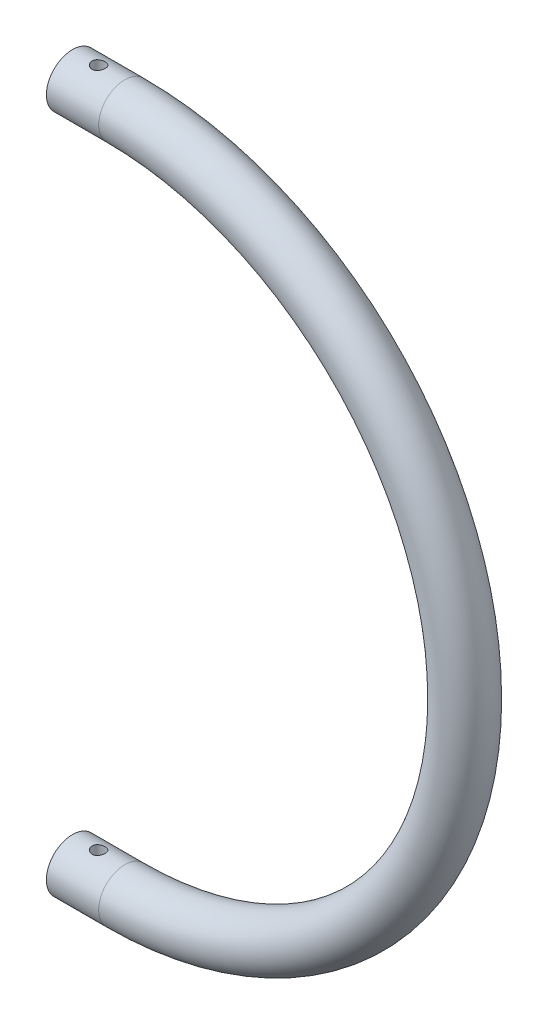
ISO-10303-21;
HEADER;
FILE_DESCRIPTION(('STEP AP214'),'2;1');
FILE_NAME('part.step','',(''),(''),'','','');
FILE_SCHEMA(('AUTOMOTIVE_DESIGN { 1 0 10303 214 1 1 1 1 }'));
ENDSEC;
DATA;
#1=APPLICATION_CONTEXT('core data for automotive mechanical design processes');
#2=APPLICATION_PROTOCOL_DEFINITION('international standard','automotive_design',2000,#1);
#3=PRODUCT_CONTEXT('',#1,'mechanical');
#4=PRODUCT('Part','Part','',(#3));
#5=PRODUCT_RELATED_PRODUCT_CATEGORY('part','',(#4));
#6=PRODUCT_DEFINITION_FORMATION('','',#4);
#7=PRODUCT_DEFINITION_CONTEXT('part definition',#1,'design');
#8=PRODUCT_DEFINITION('design','',#6,#7);
#9=PRODUCT_DEFINITION_SHAPE('','',#8);
#10=(LENGTH_UNIT() NAMED_UNIT(*) SI_UNIT(.MILLI.,.METRE.));
#11=(NAMED_UNIT(*) PLANE_ANGLE_UNIT() SI_UNIT($,.RADIAN.));
#12=(NAMED_UNIT(*) SI_UNIT($,.STERADIAN.) SOLID_ANGLE_UNIT());
#13=UNCERTAINTY_MEASURE_WITH_UNIT(LENGTH_MEASURE(1.E-05),#10,'distance_accuracy_value','');
#14=(GEOMETRIC_REPRESENTATION_CONTEXT(3) GLOBAL_UNCERTAINTY_ASSIGNED_CONTEXT((#13)) GLOBAL_UNIT_ASSIGNED_CONTEXT((#10,
#11,#12)) REPRESENTATION_CONTEXT('',''));
#15=CARTESIAN_POINT('',(0.,0.,0.));
#16=DIRECTION('',(0.,0.,1.));
#17=DIRECTION('',(1.,0.,0.));
#18=AXIS2_PLACEMENT_3D('',#15,#16,#17);
#19=CARTESIAN_POINT('',(0.,0.,0.));
#20=DIRECTION('',(0.,0.,1.));
#21=DIRECTION('',(1.,0.,0.));
#22=AXIS2_PLACEMENT_3D('',#19,#20,#21);
#23=TOROIDAL_SURFACE('',#22,130.,10.);
#24=CARTESIAN_POINT('',(0.,-130.,0.));
#25=DIRECTION('',(1.,0.,0.));
#26=DIRECTION('',(0.,1.,0.));
#27=AXIS2_PLACEMENT_3D('',#24,#25,#26);
#28=CIRCLE('',#27,10.);
#29=CARTESIAN_POINT('',(0.,-140.,0.));
#30=VERTEX_POINT('',#29);
#31=EDGE_CURVE('E52',#30,#30,#28,.T.);
#32=CARTESIAN_POINT('',(0.,130.,0.));
#33=DIRECTION('',(-1.,0.,0.));
#34=DIRECTION('',(0.,-1.,0.));
#35=AXIS2_PLACEMENT_3D('',#32,#33,#34);
#36=CIRCLE('',#35,10.);
#37=CARTESIAN_POINT('',(0.,140.,0.));
#38=VERTEX_POINT('',#37);
#39=EDGE_CURVE('E48',#38,#38,#36,.T.);
#40=CARTESIAN_POINT('',(0.,0.,0.));
#41=DIRECTION('',(0.,0.,1.));
#42=DIRECTION('',(1.,0.,0.));
#43=AXIS2_PLACEMENT_3D('',#40,#41,#42);
#44=CIRCLE('',#43,140.);
#45=EDGE_CURVE('',#30,#38,#44,.T.);
#46=ORIENTED_EDGE('',*,*,#31,.T.);
#47=ORIENTED_EDGE('',*,*,#39,.F.);
#48=ORIENTED_EDGE('',*,*,#45,.T.);
#49=ORIENTED_EDGE('',*,*,#45,.F.);
#50=EDGE_LOOP('',(#46,#48,#47,#49));
#51=FACE_BOUND('',#50,.T.);
#52=ADVANCED_FACE('F37',(#51),#23,.T.);
#53=CARTESIAN_POINT('',(-20.,-130.,0.));
#54=DIRECTION('',(1.,0.,0.));
#55=DIRECTION('',(0.,1.,0.));
#56=AXIS2_PLACEMENT_3D('',#53,#54,#55);
#57=CYLINDRICAL_SURFACE('',#56,10.);
#58=CARTESIAN_POINT('',(-12.5,-120.,0.));
#59=CARTESIAN_POINT('',(-12.4999961237697,-120.000002335533,-0.138126814449552));
#60=CARTESIAN_POINT('',(-12.4885140820437,-120.00289036447,-0.276296929717939));
#61=CARTESIAN_POINT('',(-12.442958081155,-120.014131436168,-0.548677206284221));
#62=CARTESIAN_POINT('',(-12.4088713174369,-120.022487576334,-0.682885078117899));
#63=CARTESIAN_POINT('',(-12.3192679108965,-120.043739561133,-0.943368120304294));
#64=CARTESIAN_POINT('',(-12.2637770021412,-120.056629952632,-1.06965260571667));
#65=CARTESIAN_POINT('',(-12.1330310165919,-120.085577603206,-1.31112021984071));
#66=CARTESIAN_POINT('',(-12.0577752731351,-120.101634969097,-1.4263029739146));
#67=CARTESIAN_POINT('',(-11.8879986839097,-120.135543106805,-1.64466987883486));
#68=CARTESIAN_POINT('',(-11.7931473750682,-120.153421547531,-1.74759281676843));
#69=CARTESIAN_POINT('',(-11.5875796584849,-120.188772998034,-1.93624821200553));
#70=CARTESIAN_POINT('',(-11.4768614617551,-120.206245961836,-2.02197872824865));
#71=CARTESIAN_POINT('',(-11.240674622105,-120.239087071697,-2.17504423799829));
#72=CARTESIAN_POINT('',(-11.1150112819855,-120.254420092253,-2.2420870265419));
#73=CARTESIAN_POINT('',(-10.8537526472333,-120.280841753033,-2.35399484758457));
#74=CARTESIAN_POINT('',(-10.7181589444466,-120.29193107176,-2.39886342573357));
#75=CARTESIAN_POINT('',(-10.4437608363306,-120.308325388395,-2.46425806134127));
#76=CARTESIAN_POINT('',(-10.30507517327,-120.313741816716,-2.48525378055342));
#77=CARTESIAN_POINT('',(-10.0260523850011,-120.318510625673,-2.50376962511068));
#78=CARTESIAN_POINT('',(-9.88571553217977,-120.317863992868,-2.50129356969685));
#79=CARTESIAN_POINT('',(-9.61097365375774,-120.310679908053,-2.47331087439951));
#80=CARTESIAN_POINT('',(-9.47650729755778,-120.304285616545,-2.44836390031772));
#81=CARTESIAN_POINT('',(-9.2137315818149,-120.286554838816,-2.37704031150499));
#82=CARTESIAN_POINT('',(-9.08542266161846,-120.275218000513,-2.33066217011565));
#83=CARTESIAN_POINT('',(-8.83710330624645,-120.248748101572,-2.21731579656197));
#84=CARTESIAN_POINT('',(-8.71718971368405,-120.233577875503,-2.1501444453882));
#85=CARTESIAN_POINT('',(-8.49013548373863,-120.2011714859,-1.99726046002491));
#86=CARTESIAN_POINT('',(-8.38299708655458,-120.18393496109,-1.91154458134806));
#87=CARTESIAN_POINT('',(-8.18132730717599,-120.148735324335,-1.72110570780203));
#88=CARTESIAN_POINT('',(-8.08724251656441,-120.1307655087,-1.61591043027643));
#89=CARTESIAN_POINT('',(-7.91796459589349,-120.096567240354,-1.39101986250616));
#90=CARTESIAN_POINT('',(-7.84277204289406,-120.080338840843,-1.27132412951324));
#91=CARTESIAN_POINT('',(-7.71324902295936,-120.051371131763,-1.02019314780232));
#92=CARTESIAN_POINT('',(-7.65899109957595,-120.038643997871,-0.888718988681036));
#93=CARTESIAN_POINT('',(-7.57347115715071,-120.018201383476,-0.618126680238134));
#94=CARTESIAN_POINT('',(-7.5422047393031,-120.010484944345,-0.479009998584138));
#95=CARTESIAN_POINT('',(-7.50423739073527,-120.001075012144,-0.200899950650043));
#96=CARTESIAN_POINT('',(-7.4969282898745,-119.999232441529,-0.0619945333136815));
#97=CARTESIAN_POINT('',(-7.50541500342581,-120.001353253092,0.215054791335849));
#98=CARTESIAN_POINT('',(-7.52120873799856,-120.005316112636,0.353198766074328));
#99=CARTESIAN_POINT('',(-7.57495151398563,-120.018506981211,0.622690447960818));
#100=CARTESIAN_POINT('',(-7.61256877246162,-120.027656096904,0.754108531614584));
#101=CARTESIAN_POINT('',(-7.7085118067141,-120.050188222764,1.00876215408753));
#102=CARTESIAN_POINT('',(-7.76683967385537,-120.0635716605,1.13199686505442));
#103=CARTESIAN_POINT('',(-7.90372688145779,-120.093444867896,1.36920522404972));
#104=CARTESIAN_POINT('',(-7.98262685399427,-120.10998554389,1.48297573639294));
#105=CARTESIAN_POINT('',(-8.15798318132861,-120.144258180204,1.69587768940552));
#106=CARTESIAN_POINT('',(-8.25444256602941,-120.161990345784,1.79500659828875));
#107=CARTESIAN_POINT('',(-8.46500326807284,-120.197184050675,1.97831761345414));
#108=CARTESIAN_POINT('',(-8.57947950499927,-120.214628263625,2.06207311270184));
#109=CARTESIAN_POINT('',(-8.82122105744763,-120.246785360299,2.20918459835605));
#110=CARTESIAN_POINT('',(-8.94848580495074,-120.261498365251,2.27254149026901));
#111=CARTESIAN_POINT('',(-9.21150953734373,-120.286365088053,2.37658570101224));
#112=CARTESIAN_POINT('',(-9.34721271385383,-120.296545746242,2.41740732773931));
#113=CARTESIAN_POINT('',(-9.62384939642549,-120.311220932934,2.47557609990489));
#114=CARTESIAN_POINT('',(-9.76478175170242,-120.31571670496,2.49292837912652));
#115=CARTESIAN_POINT('',(-10.0435350397693,-120.318418312984,2.50339765056083));
#116=CARTESIAN_POINT('',(-10.1813290585441,-120.31680112112,2.49719649630132));
#117=CARTESIAN_POINT('',(-10.4538398144438,-120.307868183279,2.46229546385366));
#118=CARTESIAN_POINT('',(-10.5885566133553,-120.300552551823,2.43359603781099));
#119=CARTESIAN_POINT('',(-10.8503474317764,-120.281145655268,2.35488553240496));
#120=CARTESIAN_POINT('',(-10.9774621754005,-120.269083079389,2.30500234113404));
#121=CARTESIAN_POINT('',(-11.2216089711893,-120.241537404592,2.18544152267504));
#122=CARTESIAN_POINT('',(-11.3386396219781,-120.226053831322,2.11576115005696));
#123=CARTESIAN_POINT('',(-11.5625910483368,-120.192906095607,1.95644624772858));
#124=CARTESIAN_POINT('',(-11.6691684557066,-120.175195586137,1.86633860485376));
#125=CARTESIAN_POINT('',(-11.8659117413257,-120.139866212562,1.66964895198289));
#126=CARTESIAN_POINT('',(-11.9560737168549,-120.122247371216,1.56306303543524));
#127=CARTESIAN_POINT('',(-12.1190188476077,-120.088705739205,1.33411264450432));
#128=CARTESIAN_POINT('',(-12.1914576894526,-120.072819443902,1.21149737052731));
#129=CARTESIAN_POINT('',(-12.3145791049009,-120.044917917081,0.95544343251746));
#130=CARTESIAN_POINT('',(-12.3652772677476,-120.032899913337,0.8220126057279));
#131=CARTESIAN_POINT('',(-12.4359530505494,-120.015865673908,0.57401708873912));
#132=CARTESIAN_POINT('',(-12.4599187384224,-120.009956915788,0.460633618180115));
#133=CARTESIAN_POINT('',(-12.4919432393699,-120.002023246134,0.231510119227139));
#134=CARTESIAN_POINT('',(-12.5000032488422,-119.999998042485,0.115770268737694));
#135=CARTESIAN_POINT('',(-12.5,-120.,0.));
#136=B_SPLINE_CURVE_WITH_KNOTS('',3,(#58,#59,#60,#61,#62,#63,#64,#65,#66,#67,#68,#69,#70,#71,
#72,#73,#74,#75,#76,#77,#78,#79,#80,#81,#82,#83,#84,#85,#86,#87,#88,#89,#90,#91,#92,#93,#94,#95,
#96,#97,#98,#99,#100,#101,#102,#103,#104,#105,#106,#107,#108,#109,#110,#111,#112,#113,#114,#115,
#116,#117,#118,#119,#120,#121,#122,#123,#124,#125,#126,#127,#128,#129,#130,#131,#132,#133,#134,
#135),.UNSPECIFIED.,.T.,.F.,(4,2,2,2,2,2,2,2,2,2,2,2,2,2,2,2,2,2,2,2,2,2,2,2,2,2,2,2,2,2,2,2,2,
2,2,2,2,2,4),(0.,0.413956187453149,0.828147062939833,1.24184150381018,1.65554990028221,
2.07690725728565,2.4983121596677,2.92597745909678,3.35357435282281,3.77260491835116,
4.19156730193363,4.60037495017231,5.00921172448932,5.42217546462,5.83521151399139,
6.26002501620567,6.6848514926928,7.11113715020725,7.53734122819939,7.95263848254328,
8.36789835193439,8.7770045752893,9.18615212209352,9.60255979281121,10.0190393835223,
10.4457418201299,10.8724253125471,11.2965375769764,11.7205570543048,12.1323963400748,
12.5442273493652,12.9536066760888,13.3630428023797,13.7831596069298,14.2033761629383,
14.6312030917578,15.0587227304538,15.4057040491338,15.752659267482),.UNSPECIFIED.);
#137=CARTESIAN_POINT('',(-12.5,-120.,0.));
#138=VERTEX_POINT('',#137);
#139=EDGE_CURVE('E76',#138,#138,#136,.T.);
#140=ORIENTED_EDGE('',*,*,#139,.T.);
#141=EDGE_LOOP('',(#140));
#142=FACE_BOUND('',#141,.T.);
#143=CARTESIAN_POINT('',(-7.5,-140.,0.));
#144=CARTESIAN_POINT('',(-7.50000387623026,-139.999997664467,-0.138126814449552));
#145=CARTESIAN_POINT('',(-7.51148591795631,-139.99710963553,-0.276296929717938));
#146=CARTESIAN_POINT('',(-7.55704191884501,-139.985868563832,-0.548677206284221));
#147=CARTESIAN_POINT('',(-7.59112868256308,-139.977512423666,-0.682885078117899));
#148=CARTESIAN_POINT('',(-7.68073208910348,-139.956260438867,-0.943368120304295));
#149=CARTESIAN_POINT('',(-7.73622299785878,-139.943370047368,-1.06965260571667));
#150=CARTESIAN_POINT('',(-7.86696898340807,-139.914422396794,-1.31112021984071));
#151=CARTESIAN_POINT('',(-7.94222472686495,-139.898365030903,-1.42630297391461));
#152=CARTESIAN_POINT('',(-8.1120013160903,-139.864456893195,-1.64466987883486));
#153=CARTESIAN_POINT('',(-8.20685262493177,-139.846578452469,-1.74759281676843));
#154=CARTESIAN_POINT('',(-8.41242034151506,-139.811227001966,-1.93624821200553));
#155=CARTESIAN_POINT('',(-8.52313853824489,-139.793754038164,-2.02197872824865));
#156=CARTESIAN_POINT('',(-8.75932537789499,-139.760912928303,-2.17504423799829));
#157=CARTESIAN_POINT('',(-8.88498871801455,-139.745579907747,-2.2420870265419));
#158=CARTESIAN_POINT('',(-9.14624735276672,-139.719158246967,-2.35399484758457));
#159=CARTESIAN_POINT('',(-9.28184105555336,-139.70806892824,-2.39886342573357));
#160=CARTESIAN_POINT('',(-9.55623916366943,-139.691674611605,-2.46425806134127));
#161=CARTESIAN_POINT('',(-9.69492482672999,-139.686258183284,-2.48525378055342));
#162=CARTESIAN_POINT('',(-9.97394761499891,-139.681489374327,-2.50376962511068));
#163=CARTESIAN_POINT('',(-10.1142844678202,-139.682136007132,-2.50129356969685));
#164=CARTESIAN_POINT('',(-10.3890263462423,-139.689320091947,-2.47331087439951));
#165=CARTESIAN_POINT('',(-10.5234927024422,-139.695714383455,-2.44836390031772));
#166=CARTESIAN_POINT('',(-10.7862684181851,-139.713445161184,-2.37704031150499));
#167=CARTESIAN_POINT('',(-10.9145773383815,-139.724781999487,-2.33066217011565));
#168=CARTESIAN_POINT('',(-11.1628966937535,-139.751251898428,-2.21731579656197));
#169=CARTESIAN_POINT('',(-11.2828102863159,-139.766422124497,-2.1501444453882));
#170=CARTESIAN_POINT('',(-11.5098645162614,-139.7988285141,-1.99726046002491));
#171=CARTESIAN_POINT('',(-11.6170029134454,-139.81606503891,-1.91154458134806));
#172=CARTESIAN_POINT('',(-11.818672692824,-139.851264675665,-1.72110570780203));
#173=CARTESIAN_POINT('',(-11.9127574834356,-139.8692344913,-1.61591043027643));
#174=CARTESIAN_POINT('',(-12.0820354041065,-139.903432759646,-1.39101986250616));
#175=CARTESIAN_POINT('',(-12.1572279571059,-139.919661159157,-1.27132412951324));
#176=CARTESIAN_POINT('',(-12.2867509770406,-139.948628868236,-1.02019314780232));
#177=CARTESIAN_POINT('',(-12.341008900424,-139.961356002129,-0.888718988681035));
#178=CARTESIAN_POINT('',(-12.4265288428493,-139.981798616524,-0.618126680238133));
#179=CARTESIAN_POINT('',(-12.4577952606969,-139.989515055655,-0.479009998584136));
#180=CARTESIAN_POINT('',(-12.4957626092647,-139.998924987856,-0.20089995065004));
#181=CARTESIAN_POINT('',(-12.5030717101255,-140.000767558471,-0.0619945333136788));
#182=CARTESIAN_POINT('',(-12.4945849965742,-139.998646746908,0.215054791335851));
#183=CARTESIAN_POINT('',(-12.4787912620014,-139.994683887364,0.353198766074331));
#184=CARTESIAN_POINT('',(-12.4250484860144,-139.981493018789,0.622690447960821));
#185=CARTESIAN_POINT('',(-12.3874312275384,-139.972343903096,0.754108531614587));
#186=CARTESIAN_POINT('',(-12.2914881932859,-139.949811777236,1.00876215408753));
#187=CARTESIAN_POINT('',(-12.2331603261446,-139.9364283395,1.13199686505442));
#188=CARTESIAN_POINT('',(-12.0962731185422,-139.906555132104,1.36920522404972));
#189=CARTESIAN_POINT('',(-12.0173731460057,-139.89001445611,1.48297573639295));
#190=CARTESIAN_POINT('',(-11.8420168186714,-139.855741819796,1.69587768940552));
#191=CARTESIAN_POINT('',(-11.7455574339706,-139.838009654216,1.79500659828875));
#192=CARTESIAN_POINT('',(-11.5349967319272,-139.802815949325,1.97831761345414));
#193=CARTESIAN_POINT('',(-11.4205204950007,-139.785371736375,2.06207311270184));
#194=CARTESIAN_POINT('',(-11.1787789425524,-139.753214639701,2.20918459835605));
#195=CARTESIAN_POINT('',(-11.0515141950493,-139.738501634749,2.27254149026901));
#196=CARTESIAN_POINT('',(-10.7884904626563,-139.713634911947,2.37658570101224));
#197=CARTESIAN_POINT('',(-10.6527872861462,-139.703454253758,2.41740732773931));
#198=CARTESIAN_POINT('',(-10.3761506035745,-139.688779067066,2.47557609990489));
#199=CARTESIAN_POINT('',(-10.2352182482976,-139.68428329504,2.49292837912652));
#200=CARTESIAN_POINT('',(-9.95646496023065,-139.681581687016,2.50339765056083));
#201=CARTESIAN_POINT('',(-9.81867094145593,-139.68319887888,2.49719649630132));
#202=CARTESIAN_POINT('',(-9.54616018555623,-139.692131816721,2.46229546385366));
#203=CARTESIAN_POINT('',(-9.41144338664468,-139.699447448177,2.43359603781098));
#204=CARTESIAN_POINT('',(-9.14965256822356,-139.718854344732,2.35488553240495));
#205=CARTESIAN_POINT('',(-9.02253782459945,-139.730916920611,2.30500234113404));
#206=CARTESIAN_POINT('',(-8.77839102881072,-139.758462595408,2.18544152267504));
#207=CARTESIAN_POINT('',(-8.66136037802186,-139.773946168678,2.11576115005696));
#208=CARTESIAN_POINT('',(-8.43740895166324,-139.807093904393,1.95644624772858));
#209=CARTESIAN_POINT('',(-8.33083154429339,-139.824804413863,1.86633860485376));
#210=CARTESIAN_POINT('',(-8.13408825867434,-139.860133787438,1.66964895198288));
#211=CARTESIAN_POINT('',(-8.04392628314506,-139.877752628784,1.56306303543524));
#212=CARTESIAN_POINT('',(-7.88098115239232,-139.911294260794,1.33411264450432));
#213=CARTESIAN_POINT('',(-7.80854231054737,-139.927180556098,1.21149737052731));
#214=CARTESIAN_POINT('',(-7.68542089509912,-139.955082082919,0.95544343251746));
#215=CARTESIAN_POINT('',(-7.63472273225244,-139.967100086663,0.8220126057279));
#216=CARTESIAN_POINT('',(-7.56404694945058,-139.984134326092,0.574017088739121));
#217=CARTESIAN_POINT('',(-7.54008126157761,-139.990043084211,0.460633618180115));
#218=CARTESIAN_POINT('',(-7.5080567606301,-139.997976753866,0.231510119227139));
#219=CARTESIAN_POINT('',(-7.49999675115783,-140.000001957515,0.115770268737694));
#220=CARTESIAN_POINT('',(-7.5,-140.,0.));
#221=B_SPLINE_CURVE_WITH_KNOTS('',3,(#143,#144,#145,#146,#147,#148,#149,#150,#151,#152,#153,
#154,#155,#156,#157,#158,#159,#160,#161,#162,#163,#164,#165,#166,#167,#168,#169,#170,#171,#172,
#173,#174,#175,#176,#177,#178,#179,#180,#181,#182,#183,#184,#185,#186,#187,#188,#189,#190,#191,
#192,#193,#194,#195,#196,#197,#198,#199,#200,#201,#202,#203,#204,#205,#206,#207,#208,#209,#210,
#211,#212,#213,#214,#215,#216,#217,#218,#219,#220),.UNSPECIFIED.,.T.,.F.,(4,2,2,2,2,2,2,2,2,2,2,
2,2,2,2,2,2,2,2,2,2,2,2,2,2,2,2,2,2,2,2,2,2,2,2,2,2,2,4),(0.,0.41395618745315,0.828147062939832,
1.24184150381018,1.65554990028221,2.07690725728565,2.49831215966769,2.92597745909678,
3.3535743528228,3.77260491835116,4.19156730193363,4.60037495017231,5.00921172448932,
5.42217546461999,5.83521151399139,6.26002501620566,6.6848514926928,7.11113715020725,
7.5373412281994,7.95263848254328,8.36789835193439,8.7770045752893,9.18615212209352,
9.60255979281122,10.0190393835223,10.4457418201299,10.8724253125472,11.2965375769764,
11.7205570543048,12.1323963400748,12.5442273493652,12.9536066760888,13.3630428023797,
13.7831596069298,14.2033761629383,14.6312030917578,15.0587227304538,15.4057040491338,
15.752659267482),.UNSPECIFIED.);
#222=CARTESIAN_POINT('',(-7.5,-140.,0.));
#223=VERTEX_POINT('',#222);
#224=EDGE_CURVE('E72',#223,#223,#221,.T.);
#225=ORIENTED_EDGE('',*,*,#224,.T.);
#226=EDGE_LOOP('',(#225));
#227=FACE_BOUND('',#226,.T.);
#228=CARTESIAN_POINT('',(-20.,-130.,0.));
#229=DIRECTION('',(-1.,0.,0.));
#230=DIRECTION('',(0.,-1.,0.));
#231=AXIS2_PLACEMENT_3D('',#228,#229,#230);
#232=CIRCLE('',#231,10.);
#233=CARTESIAN_POINT('',(-20.,-140.,0.));
#234=VERTEX_POINT('',#233);
#235=EDGE_CURVE('E102',#234,#234,#232,.T.);
#236=ORIENTED_EDGE('',*,*,#235,.F.);
#237=EDGE_LOOP('',(#236));
#238=FACE_BOUND('',#237,.T.);
#239=ORIENTED_EDGE('',*,*,#31,.F.);
#240=EDGE_LOOP('',(#239));
#241=FACE_BOUND('',#240,.T.);
#242=ADVANCED_FACE('F80',(#142,#227,#238,#241),#57,.T.);
#243=CARTESIAN_POINT('',(-20.,-130.,0.));
#244=DIRECTION('',(-1.,0.,0.));
#245=DIRECTION('',(0.,-1.,0.));
#246=AXIS2_PLACEMENT_3D('',#243,#244,#245);
#247=PLANE('',#246);
#248=ORIENTED_EDGE('',*,*,#235,.T.);
#249=EDGE_LOOP('',(#248));
#250=FACE_BOUND('',#249,.T.);
#251=ADVANCED_FACE('F83',(#250),#247,.T.);
#252=CARTESIAN_POINT('',(-20.,130.,0.));
#253=DIRECTION('',(1.,0.,0.));
#254=DIRECTION('',(0.,1.,0.));
#255=AXIS2_PLACEMENT_3D('',#252,#253,#254);
#256=CYLINDRICAL_SURFACE('',#255,10.);
#257=CARTESIAN_POINT('',(-10.,120.317541634481,2.5));
#258=CARTESIAN_POINT('',(-9.86194924907342,120.317538999121,2.49999607859307));
#259=CARTESIAN_POINT('',(-9.72385510132148,120.314556939854,2.48852624549765));
#260=CARTESIAN_POINT('',(-9.45163242182649,120.302981380074,2.44302312546379));
#261=CARTESIAN_POINT('',(-9.31750624553182,120.294384613784,2.40897670674211));
#262=CARTESIAN_POINT('',(-9.05719646181282,120.272612754038,2.31949119963204));
#263=CARTESIAN_POINT('',(-8.93100284461429,120.259443573095,2.26407972785449));
#264=CARTESIAN_POINT('',(-8.68968914746012,120.230018079712,2.13352114126138));
#265=CARTESIAN_POINT('',(-8.57456953791978,120.213761636215,2.05837318856069));
#266=CARTESIAN_POINT('',(-8.35613835473778,120.179592836444,1.88870842731188));
#267=CARTESIAN_POINT('',(-8.25310639964995,120.16165402377,1.79383688770405));
#268=CARTESIAN_POINT('',(-8.06423860563966,120.126371244847,1.58818206410066));
#269=CARTESIAN_POINT('',(-7.97840437437825,120.109027334336,1.47739729418031));
#270=CARTESIAN_POINT('',(-7.82522453236872,120.076595844794,1.24114520107895));
#271=CARTESIAN_POINT('',(-7.75815361183853,120.061543125994,1.11549457619512));
#272=CARTESIAN_POINT('',(-7.64619035584692,120.03569188074,0.854263184292762));
#273=CARTESIAN_POINT('',(-7.60129474808449,120.024892726657,0.71868388579194));
#274=CARTESIAN_POINT('',(-7.53585216542142,120.008952411518,0.444358758754162));
#275=CARTESIAN_POINT('',(-7.51483035567342,120.003701061557,0.305732719548976));
#276=CARTESIAN_POINT('',(-7.49624162072445,119.999064058927,0.0268288192627697));
#277=CARTESIAN_POINT('',(-7.4986712277904,119.999677539033,-0.113448794538068));
#278=CARTESIAN_POINT('',(-7.52657485025015,120.006619050465,-0.388380617930968));
#279=CARTESIAN_POINT('',(-7.55153632505386,120.012819976591,-0.523090539002668));
#280=CARTESIAN_POINT('',(-7.6229712700485,120.030091634751,-0.786345618534216));
#281=CARTESIAN_POINT('',(-7.66944588537741,120.041162626015,-0.914890448426095));
#282=CARTESIAN_POINT('',(-7.78300257068707,120.067124902991,-1.16351675875452));
#283=CARTESIAN_POINT('',(-7.85026704466175,120.08204980305,-1.28351127441626));
#284=CARTESIAN_POINT('',(-8.00335567911626,120.114100961903,-1.51068905585122));
#285=CARTESIAN_POINT('',(-8.08918306856063,120.131227603473,-1.61787008771377));
#286=CARTESIAN_POINT('',(-8.27970874198237,120.166362862306,-1.81943508771239));
#287=CARTESIAN_POINT('',(-8.38485489234775,120.184382804747,-1.91339419768799));
#288=CARTESIAN_POINT('',(-8.60959997354028,120.218849564827,-2.08244093990755));
#289=CARTESIAN_POINT('',(-8.72919957949111,120.235296308917,-2.15752769011507));
#290=CARTESIAN_POINT('',(-8.98029003414886,120.264795031707,-2.28697032255647));
#291=CARTESIAN_POINT('',(-9.11183573031281,120.27783016283,-2.34122391742612));
#292=CARTESIAN_POINT('',(-9.38258546807685,120.298813598513,-2.42671405159095));
#293=CARTESIAN_POINT('',(-9.5217878639846,120.306762991573,-2.45795551638266));
#294=CARTESIAN_POINT('',(-9.79995950152992,120.316446439925,-2.49582963866592));
#295=CARTESIAN_POINT('',(-9.93883779334103,120.318339110231,-2.50309047391912));
#296=CARTESIAN_POINT('',(-10.2158219365853,120.316126566353,-2.49451699051516));
#297=CARTESIAN_POINT('',(-10.3539278579494,120.312021904297,-2.4786847978498));
#298=CARTESIAN_POINT('',(-10.6231142649486,120.29842918015,-2.42492546393825));
#299=CARTESIAN_POINT('',(-10.7542727265692,120.289030297575,-2.3873640682819));
#300=CARTESIAN_POINT('',(-11.0084314578533,120.265992817372,-2.29161808167046));
#301=CARTESIAN_POINT('',(-11.1314307590558,120.252353717536,-2.2334310477125));
#302=CARTESIAN_POINT('',(-11.3684412778669,120.222038629045,-2.0967706679366));
#303=CARTESIAN_POINT('',(-11.482228840043,120.205308313928,-2.01792175383564));
#304=CARTESIAN_POINT('',(-11.6951883628015,120.170829169289,-1.84265073233613));
#305=CARTESIAN_POINT('',(-11.7943579166501,120.153080172717,-1.74622573701359));
#306=CARTESIAN_POINT('',(-11.9778110425709,120.118025969682,-1.53565680246182));
#307=CARTESIAN_POINT('',(-12.0616600625488,120.100742979381,-1.42112988132898));
#308=CARTESIAN_POINT('',(-12.2089358669513,120.069027833863,-1.17925670673669));
#309=CARTESIAN_POINT('',(-12.2723637166082,120.05459552996,-1.05191112239397));
#310=CARTESIAN_POINT('',(-12.3764460345279,120.030298842617,-0.788895504327723));
#311=CARTESIAN_POINT('',(-12.4172642843791,120.020401699776,-0.653293452569702));
#312=CARTESIAN_POINT('',(-12.4754603346084,120.006147066042,-0.376874400797014));
#313=CARTESIAN_POINT('',(-12.492842658739,120.001788506066,-0.236058412603098));
#314=CARTESIAN_POINT('',(-12.5034189739388,119.99914576478,0.0427088161083113));
#315=CARTESIAN_POINT('',(-12.4972542727385,120.000700528,0.180634567415057));
#316=CARTESIAN_POINT('',(-12.4623804317641,120.009352588564,0.45341874103688));
#317=CARTESIAN_POINT('',(-12.4336719624671,120.016449721071,0.588277254452325));
#318=CARTESIAN_POINT('',(-12.3548694505728,120.035364178653,0.850427589111939));
#319=CARTESIAN_POINT('',(-12.3048913667141,120.04715588744,0.977756236452161));
#320=CARTESIAN_POINT('',(-12.1850735524511,120.074217777159,1.22229263260406));
#321=CARTESIAN_POINT('',(-12.1152313183238,120.089488396531,1.33949910316409));
#322=CARTESIAN_POINT('',(-11.9557119150097,120.122318757993,1.56350482105826));
#323=CARTESIAN_POINT('',(-11.8655996427404,120.139924576458,1.66998747074584));
#324=CARTESIAN_POINT('',(-11.6689428700566,120.17523377357,1.86653755068376));
#325=CARTESIAN_POINT('',(-11.5623942097221,120.192937175817,1.95660081269148));
#326=CARTESIAN_POINT('',(-11.3334964645263,120.226813103862,2.11940506617958));
#327=CARTESIAN_POINT('',(-11.2108896915869,120.242950908168,2.19179154854095));
#328=CARTESIAN_POINT('',(-10.9548612753129,120.271401112629,2.31481724146368));
#329=CARTESIAN_POINT('',(-10.8214475847654,120.28371629417,2.36547227438038));
#330=CARTESIAN_POINT('',(-10.5735574704121,120.301202281232,2.43605632142751));
#331=CARTESIAN_POINT('',(-10.4602670890347,120.307283424912,2.4599829264922));
#332=CARTESIAN_POINT('',(-10.2313278275058,120.315454035434,2.49195573142942));
#333=CARTESIAN_POINT('',(-10.115679149389,120.317543842772,2.50000328592938));
#334=CARTESIAN_POINT('',(-10.,120.317541634481,2.5));
#335=B_SPLINE_CURVE_WITH_KNOTS('',3,(#257,#258,#259,#260,#261,#262,#263,#264,#265,#266,#267,
#268,#269,#270,#271,#272,#273,#274,#275,#276,#277,#278,#279,#280,#281,#282,#283,#284,#285,#286,
#287,#288,#289,#290,#291,#292,#293,#294,#295,#296,#297,#298,#299,#300,#301,#302,#303,#304,#305,
#306,#307,#308,#309,#310,#311,#312,#313,#314,#315,#316,#317,#318,#319,#320,#321,#322,#323,#324,
#325,#326,#327,#328,#329,#330,#331,#332,#333,#334),.UNSPECIFIED.,.T.,.F.,(4,2,2,2,2,2,2,2,2,2,2,
2,2,2,2,2,2,2,2,2,2,2,2,2,2,2,2,2,2,2,2,2,2,2,2,2,2,2,4),(0.,0.413727441736135,
0.827695741428666,1.24113072716602,1.65458326755479,2.07623954192976,2.49793521479867,
2.9255149639792,3.35303159847092,3.77188750995347,4.19068148666021,4.60018262688947,
5.00970556724786,5.42292874254445,5.83622385468913,6.26070466571912,6.68520531199802,
7.11176432008403,7.53823200129548,7.95343574764204,8.36860127188747,8.77697405014152,
9.18539521426363,9.60182845864103,10.0183301888999,10.4452533097026,10.872154157245,
11.2959207281187,11.7196054891398,12.131834461324,12.5440511738193,12.9540487656466,
13.3640980574302,13.7839709658702,14.2039503157045,14.6317647729113,15.0592672137502,
15.4059782718573,15.7526597510792),.UNSPECIFIED.);
#336=CARTESIAN_POINT('',(-10.,120.317541634481,2.5));
#337=VERTEX_POINT('',#336);
#338=EDGE_CURVE('E40',#337,#337,#335,.T.);
#339=ORIENTED_EDGE('',*,*,#338,.T.);
#340=EDGE_LOOP('',(#339));
#341=FACE_BOUND('',#340,.T.);
#342=CARTESIAN_POINT('',(-12.5,140.,0.));
#343=CARTESIAN_POINT('',(-12.4999961237697,139.999997664467,-0.138126814449552));
#344=CARTESIAN_POINT('',(-12.4885140820437,139.99710963553,-0.276296929717938));
#345=CARTESIAN_POINT('',(-12.442958081155,139.985868563832,-0.548677206284221));
#346=CARTESIAN_POINT('',(-12.4088713174369,139.977512423666,-0.682885078117899));
#347=CARTESIAN_POINT('',(-12.3192679108965,139.956260438867,-0.943368120304293));
#348=CARTESIAN_POINT('',(-12.2637770021412,139.943370047368,-1.06965260571667));
#349=CARTESIAN_POINT('',(-12.1330310165919,139.914422396794,-1.31112021984071));
#350=CARTESIAN_POINT('',(-12.0577752731351,139.898365030903,-1.4263029739146));
#351=CARTESIAN_POINT('',(-11.8879986839097,139.864456893195,-1.64466987883486));
#352=CARTESIAN_POINT('',(-11.7931473750682,139.846578452469,-1.74759281676843));
#353=CARTESIAN_POINT('',(-11.5875796584849,139.811227001966,-1.93624821200553));
#354=CARTESIAN_POINT('',(-11.4768614617551,139.793754038164,-2.02197872824865));
#355=CARTESIAN_POINT('',(-11.240674622105,139.760912928303,-2.17504423799829));
#356=CARTESIAN_POINT('',(-11.1150112819855,139.745579907747,-2.2420870265419));
#357=CARTESIAN_POINT('',(-10.8537526472333,139.719158246967,-2.35399484758457));
#358=CARTESIAN_POINT('',(-10.7181589444466,139.70806892824,-2.39886342573357));
#359=CARTESIAN_POINT('',(-10.4437608363306,139.691674611605,-2.46425806134127));
#360=CARTESIAN_POINT('',(-10.30507517327,139.686258183284,-2.48525378055342));
#361=CARTESIAN_POINT('',(-10.0260523850011,139.681489374327,-2.50376962511068));
#362=CARTESIAN_POINT('',(-9.88571553217977,139.682136007132,-2.50129356969685));
#363=CARTESIAN_POINT('',(-9.61097365375775,139.689320091947,-2.47331087439951));
#364=CARTESIAN_POINT('',(-9.47650729755778,139.695714383455,-2.44836390031772));
#365=CARTESIAN_POINT('',(-9.2137315818149,139.713445161184,-2.37704031150499));
#366=CARTESIAN_POINT('',(-9.08542266161847,139.724781999487,-2.33066217011565));
#367=CARTESIAN_POINT('',(-8.83710330624645,139.751251898428,-2.21731579656197));
#368=CARTESIAN_POINT('',(-8.71718971368406,139.766422124497,-2.1501444453882));
#369=CARTESIAN_POINT('',(-8.49013548373864,139.7988285141,-1.99726046002491));
#370=CARTESIAN_POINT('',(-8.38299708655459,139.81606503891,-1.91154458134806));
#371=CARTESIAN_POINT('',(-8.18132730717599,139.851264675665,-1.72110570780203));
#372=CARTESIAN_POINT('',(-8.08724251656442,139.8692344913,-1.61591043027644));
#373=CARTESIAN_POINT('',(-7.9179645958935,139.903432759646,-1.39101986250617));
#374=CARTESIAN_POINT('',(-7.84277204289406,139.919661159157,-1.27132412951324));
#375=CARTESIAN_POINT('',(-7.71324902295936,139.948628868236,-1.02019314780232));
#376=CARTESIAN_POINT('',(-7.65899109957595,139.961356002129,-0.88871898868104));
#377=CARTESIAN_POINT('',(-7.57347115715071,139.981798616524,-0.618126680238138));
#378=CARTESIAN_POINT('',(-7.5422047393031,139.989515055655,-0.479009998584142));
#379=CARTESIAN_POINT('',(-7.50423739073527,139.998924987856,-0.200899950650045));
#380=CARTESIAN_POINT('',(-7.4969282898745,140.000767558471,-0.061994533313684));
#381=CARTESIAN_POINT('',(-7.50541500342581,139.998646746908,0.215054791335847));
#382=CARTESIAN_POINT('',(-7.52120873799856,139.994683887364,0.353198766074326));
#383=CARTESIAN_POINT('',(-7.57495151398563,139.981493018789,0.622690447960816));
#384=CARTESIAN_POINT('',(-7.61256877246162,139.972343903096,0.754108531614582));
#385=CARTESIAN_POINT('',(-7.7085118067141,139.949811777236,1.00876215408752));
#386=CARTESIAN_POINT('',(-7.76683967385537,139.9364283395,1.13199686505442));
#387=CARTESIAN_POINT('',(-7.90372688145779,139.906555132104,1.36920522404971));
#388=CARTESIAN_POINT('',(-7.98262685399427,139.89001445611,1.48297573639294));
#389=CARTESIAN_POINT('',(-8.15798318132861,139.855741819796,1.69587768940551));
#390=CARTESIAN_POINT('',(-8.25444256602941,139.838009654216,1.79500659828874));
#391=CARTESIAN_POINT('',(-8.46500326807284,139.802815949325,1.97831761345414));
#392=CARTESIAN_POINT('',(-8.57947950499927,139.785371736375,2.06207311270184));
#393=CARTESIAN_POINT('',(-8.82122105744763,139.753214639701,2.20918459835604));
#394=CARTESIAN_POINT('',(-8.94848580495074,139.738501634749,2.27254149026901));
#395=CARTESIAN_POINT('',(-9.21150953734373,139.713634911947,2.37658570101223));
#396=CARTESIAN_POINT('',(-9.34721271385382,139.703454253758,2.41740732773931));
#397=CARTESIAN_POINT('',(-9.62384939642549,139.688779067066,2.47557609990489));
#398=CARTESIAN_POINT('',(-9.76478175170241,139.68428329504,2.49292837912652));
#399=CARTESIAN_POINT('',(-10.0435350397693,139.681581687016,2.50339765056083));
#400=CARTESIAN_POINT('',(-10.1813290585441,139.68319887888,2.49719649630132));
#401=CARTESIAN_POINT('',(-10.4538398144438,139.692131816721,2.46229546385366));
#402=CARTESIAN_POINT('',(-10.5885566133553,139.699447448177,2.43359603781099));
#403=CARTESIAN_POINT('',(-10.8503474317764,139.718854344732,2.35488553240496));
#404=CARTESIAN_POINT('',(-10.9774621754006,139.730916920611,2.30500234113404));
#405=CARTESIAN_POINT('',(-11.2216089711893,139.758462595408,2.18544152267504));
#406=CARTESIAN_POINT('',(-11.3386396219781,139.773946168678,2.11576115005696));
#407=CARTESIAN_POINT('',(-11.5625910483368,139.807093904393,1.95644624772859));
#408=CARTESIAN_POINT('',(-11.6691684557066,139.824804413863,1.86633860485377));
#409=CARTESIAN_POINT('',(-11.8659117413257,139.860133787438,1.66964895198289));
#410=CARTESIAN_POINT('',(-11.9560737168549,139.877752628784,1.56306303543524));
#411=CARTESIAN_POINT('',(-12.1190188476077,139.911294260794,1.33411264450432));
#412=CARTESIAN_POINT('',(-12.1914576894526,139.927180556098,1.21149737052731));
#413=CARTESIAN_POINT('',(-12.3145791049009,139.955082082919,0.955443432517462));
#414=CARTESIAN_POINT('',(-12.3652772677476,139.967100086663,0.822012605727901));
#415=CARTESIAN_POINT('',(-12.4359530505494,139.984134326092,0.574017088739121));
#416=CARTESIAN_POINT('',(-12.4599187384224,139.990043084211,0.460633618180116));
#417=CARTESIAN_POINT('',(-12.4919432393699,139.997976753866,0.231510119227139));
#418=CARTESIAN_POINT('',(-12.5000032488422,140.000001957515,0.115770268737694));
#419=CARTESIAN_POINT('',(-12.5,140.,0.));
#420=B_SPLINE_CURVE_WITH_KNOTS('',3,(#342,#343,#344,#345,#346,#347,#348,#349,#350,#351,#352,
#353,#354,#355,#356,#357,#358,#359,#360,#361,#362,#363,#364,#365,#366,#367,#368,#369,#370,#371,
#372,#373,#374,#375,#376,#377,#378,#379,#380,#381,#382,#383,#384,#385,#386,#387,#388,#389,#390,
#391,#392,#393,#394,#395,#396,#397,#398,#399,#400,#401,#402,#403,#404,#405,#406,#407,#408,#409,
#410,#411,#412,#413,#414,#415,#416,#417,#418,#419),.UNSPECIFIED.,.T.,.F.,(4,2,2,2,2,2,2,2,2,2,2,
2,2,2,2,2,2,2,2,2,2,2,2,2,2,2,2,2,2,2,2,2,2,2,2,2,2,2,4),(0.,0.413956187453149,
0.828147062939832,1.24184150381017,1.65554990028221,2.07690725728566,2.4983121596677,
2.92597745909678,3.3535743528228,3.77260491835116,4.19156730193363,4.60037495017231,
5.00921172448932,5.42217546461999,5.83521151399139,6.26002501620566,6.68485149269279,
7.11113715020724,7.53734122819939,7.95263848254328,8.36789835193439,8.7770045752893,
9.18615212209352,9.60255979281121,10.0190393835223,10.4457418201299,10.8724253125471,
11.2965375769764,11.7205570543048,12.1323963400748,12.5442273493652,12.9536066760888,
13.3630428023797,13.7831596069298,14.2033761629383,14.6312030917578,15.0587227304538,
15.4057040491338,15.752659267482),.UNSPECIFIED.);
#421=CARTESIAN_POINT('',(-12.5,140.,0.));
#422=VERTEX_POINT('',#421);
#423=EDGE_CURVE('E11',#422,#422,#420,.T.);
#424=ORIENTED_EDGE('',*,*,#423,.T.);
#425=EDGE_LOOP('',(#424));
#426=FACE_BOUND('',#425,.T.);
#427=CARTESIAN_POINT('',(-20.,130.,0.));
#428=DIRECTION('',(-1.,0.,0.));
#429=DIRECTION('',(0.,-1.,0.));
#430=AXIS2_PLACEMENT_3D('',#427,#428,#429);
#431=CIRCLE('',#430,10.);
#432=CARTESIAN_POINT('',(-20.,120.,0.));
#433=VERTEX_POINT('',#432);
#434=EDGE_CURVE('E103',#433,#433,#431,.T.);
#435=ORIENTED_EDGE('',*,*,#434,.F.);
#436=EDGE_LOOP('',(#435));
#437=FACE_BOUND('',#436,.T.);
#438=ORIENTED_EDGE('',*,*,#39,.T.);
#439=EDGE_LOOP('',(#438));
#440=FACE_BOUND('',#439,.T.);
#441=ADVANCED_FACE('F57',(#341,#426,#437,#440),#256,.T.);
#442=CARTESIAN_POINT('',(-20.,130.,0.));
#443=DIRECTION('',(-1.,0.,0.));
#444=DIRECTION('',(0.,-1.,0.));
#445=AXIS2_PLACEMENT_3D('',#442,#443,#444);
#446=PLANE('',#445);
#447=ORIENTED_EDGE('',*,*,#434,.T.);
#448=EDGE_LOOP('',(#447));
#449=FACE_BOUND('',#448,.T.);
#450=ADVANCED_FACE('F66',(#449),#446,.T.);
#451=CARTESIAN_POINT('',(-10.,-140.,0.));
#452=DIRECTION('',(0.,1.,0.));
#453=DIRECTION('',(0.,0.,1.));
#454=AXIS2_PLACEMENT_3D('',#451,#452,#453);
#455=CYLINDRICAL_SURFACE('',#454,2.5);
#456=ORIENTED_EDGE('',*,*,#338,.F.);
#457=EDGE_LOOP('',(#456));
#458=FACE_BOUND('',#457,.T.);
#459=ORIENTED_EDGE('',*,*,#423,.F.);
#460=EDGE_LOOP('',(#459));
#461=FACE_BOUND('',#460,.T.);
#462=ADVANCED_FACE('F64',(#458,#461),#455,.F.);
#463=ORIENTED_EDGE('',*,*,#224,.F.);
#464=EDGE_LOOP('',(#463));
#465=FACE_BOUND('',#464,.T.);
#466=ORIENTED_EDGE('',*,*,#139,.F.);
#467=EDGE_LOOP('',(#466));
#468=FACE_BOUND('',#467,.T.);
#469=ADVANCED_FACE('F61',(#465,#468),#455,.F.);
#470=CLOSED_SHELL('',(#52,#242,#251,#441,#450,#462,#469));
#471=MANIFOLD_SOLID_BREP('B2',#470);
#472=ADVANCED_BREP_SHAPE_REPRESENTATION('',(#18,#471),#14);
#473=SHAPE_DEFINITION_REPRESENTATION(#9,#472);
ENDSEC;
END-ISO-10303-21;
